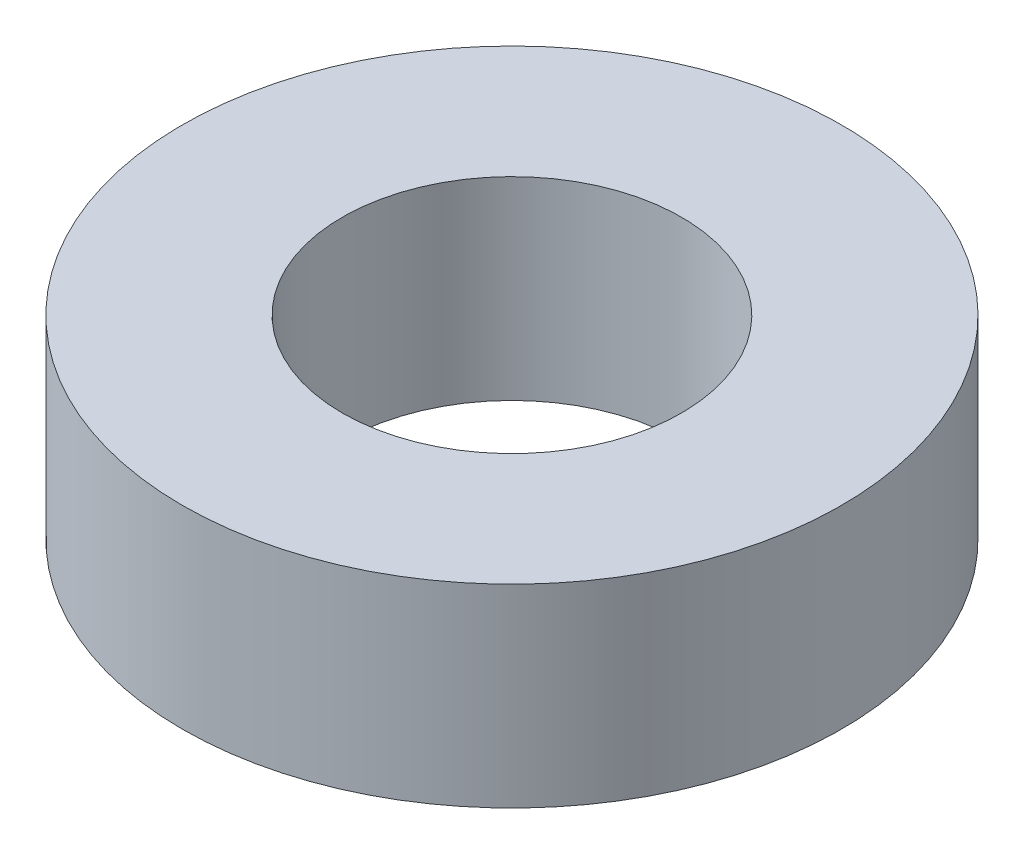
ISO-10303-21;
HEADER;
FILE_DESCRIPTION(('STEP AP214'),'2;1');
FILE_NAME('part.step','',(''),(''),'','','');
FILE_SCHEMA(('AUTOMOTIVE_DESIGN { 1 0 10303 214 1 1 1 1 }'));
ENDSEC;
DATA;
#1=APPLICATION_CONTEXT('core data for automotive mechanical design processes');
#2=APPLICATION_PROTOCOL_DEFINITION('international standard','automotive_design',2000,#1);
#3=PRODUCT_CONTEXT('',#1,'mechanical');
#4=PRODUCT('Part','Part','',(#3));
#5=PRODUCT_RELATED_PRODUCT_CATEGORY('part','',(#4));
#6=PRODUCT_DEFINITION_FORMATION('','',#4);
#7=PRODUCT_DEFINITION_CONTEXT('part definition',#1,'design');
#8=PRODUCT_DEFINITION('design','',#6,#7);
#9=PRODUCT_DEFINITION_SHAPE('','',#8);
#10=(LENGTH_UNIT() NAMED_UNIT(*) SI_UNIT(.MILLI.,.METRE.));
#11=(NAMED_UNIT(*) PLANE_ANGLE_UNIT() SI_UNIT($,.RADIAN.));
#12=(NAMED_UNIT(*) SI_UNIT($,.STERADIAN.) SOLID_ANGLE_UNIT());
#13=UNCERTAINTY_MEASURE_WITH_UNIT(LENGTH_MEASURE(1.E-05),#10,'distance_accuracy_value','');
#14=(GEOMETRIC_REPRESENTATION_CONTEXT(3) GLOBAL_UNCERTAINTY_ASSIGNED_CONTEXT((#13)) GLOBAL_UNIT_ASSIGNED_CONTEXT((#10,
#11,#12)) REPRESENTATION_CONTEXT('',''));
#15=CARTESIAN_POINT('',(0.,0.,0.));
#16=DIRECTION('',(0.,0.,1.));
#17=DIRECTION('',(1.,0.,0.));
#18=AXIS2_PLACEMENT_3D('',#15,#16,#17);
#19=CARTESIAN_POINT('',(0.,5.,0.));
#20=DIRECTION('',(0.,1.,0.));
#21=DIRECTION('',(0.,0.,1.));
#22=AXIS2_PLACEMENT_3D('',#19,#20,#21);
#23=PLANE('',#22);
#24=CARTESIAN_POINT('',(0.,5.,0.));
#25=DIRECTION('',(0.,1.,0.));
#26=DIRECTION('',(0.,0.,1.));
#27=AXIS2_PLACEMENT_3D('',#24,#25,#26);
#28=CIRCLE('',#27,8.5);
#29=CARTESIAN_POINT('',(0.,5.,8.5));
#30=VERTEX_POINT('',#29);
#31=EDGE_CURVE('E10',#30,#30,#28,.T.);
#32=ORIENTED_EDGE('',*,*,#31,.T.);
#33=EDGE_LOOP('',(#32));
#34=FACE_BOUND('',#33,.T.);
#35=CARTESIAN_POINT('',(0.,5.,0.));
#36=DIRECTION('',(0.,1.,0.));
#37=DIRECTION('',(0.,0.,1.));
#38=AXIS2_PLACEMENT_3D('',#35,#36,#37);
#39=CIRCLE('',#38,4.375);
#40=CARTESIAN_POINT('',(0.,5.,4.375));
#41=VERTEX_POINT('',#40);
#42=EDGE_CURVE('E42',#41,#41,#39,.T.);
#43=ORIENTED_EDGE('',*,*,#42,.F.);
#44=EDGE_LOOP('',(#43));
#45=FACE_BOUND('',#44,.T.);
#46=ADVANCED_FACE('F31',(#34,#45),#23,.T.);
#47=CARTESIAN_POINT('',(0.,0.,0.));
#48=DIRECTION('',(0.,1.,0.));
#49=DIRECTION('',(0.,0.,1.));
#50=AXIS2_PLACEMENT_3D('',#47,#48,#49);
#51=PLANE('',#50);
#52=CARTESIAN_POINT('',(0.,0.,0.));
#53=DIRECTION('',(0.,1.,0.));
#54=DIRECTION('',(0.,0.,1.));
#55=AXIS2_PLACEMENT_3D('',#52,#53,#54);
#56=CIRCLE('',#55,8.5);
#57=CARTESIAN_POINT('',(0.,0.,8.5));
#58=VERTEX_POINT('',#57);
#59=EDGE_CURVE('E35',#58,#58,#56,.T.);
#60=ORIENTED_EDGE('',*,*,#59,.F.);
#61=EDGE_LOOP('',(#60));
#62=FACE_BOUND('',#61,.T.);
#63=CARTESIAN_POINT('',(0.,0.,0.));
#64=DIRECTION('',(0.,1.,0.));
#65=DIRECTION('',(0.,0.,1.));
#66=AXIS2_PLACEMENT_3D('',#63,#64,#65);
#67=CIRCLE('',#66,4.375);
#68=CARTESIAN_POINT('',(0.,0.,4.375));
#69=VERTEX_POINT('',#68);
#70=EDGE_CURVE('E44',#69,#69,#67,.T.);
#71=ORIENTED_EDGE('',*,*,#70,.T.);
#72=EDGE_LOOP('',(#71));
#73=FACE_BOUND('',#72,.T.);
#74=ADVANCED_FACE('F54',(#62,#73),#51,.F.);
#75=CARTESIAN_POINT('',(0.,5.,0.));
#76=DIRECTION('',(0.,-1.,0.));
#77=DIRECTION('',(0.,0.,-1.));
#78=AXIS2_PLACEMENT_3D('',#75,#76,#77);
#79=CYLINDRICAL_SURFACE('',#78,8.5);
#80=ORIENTED_EDGE('',*,*,#31,.F.);
#81=EDGE_LOOP('',(#80));
#82=FACE_BOUND('',#81,.T.);
#83=ORIENTED_EDGE('',*,*,#59,.T.);
#84=EDGE_LOOP('',(#83));
#85=FACE_BOUND('',#84,.T.);
#86=ADVANCED_FACE('F33',(#82,#85),#79,.T.);
#87=CARTESIAN_POINT('',(0.,5.,0.));
#88=DIRECTION('',(0.,-1.,0.));
#89=DIRECTION('',(0.,0.,-1.));
#90=AXIS2_PLACEMENT_3D('',#87,#88,#89);
#91=CYLINDRICAL_SURFACE('',#90,4.375);
#92=ORIENTED_EDGE('',*,*,#42,.T.);
#93=EDGE_LOOP('',(#92));
#94=FACE_BOUND('',#93,.T.);
#95=ORIENTED_EDGE('',*,*,#70,.F.);
#96=EDGE_LOOP('',(#95));
#97=FACE_BOUND('',#96,.T.);
#98=ADVANCED_FACE('F50',(#94,#97),#91,.F.);
#99=CLOSED_SHELL('',(#46,#74,#86,#98));
#100=MANIFOLD_SOLID_BREP('B2',#99);
#101=ADVANCED_BREP_SHAPE_REPRESENTATION('',(#18,#100),#14);
#102=SHAPE_DEFINITION_REPRESENTATION(#9,#101);
ENDSEC;
END-ISO-10303-21;
